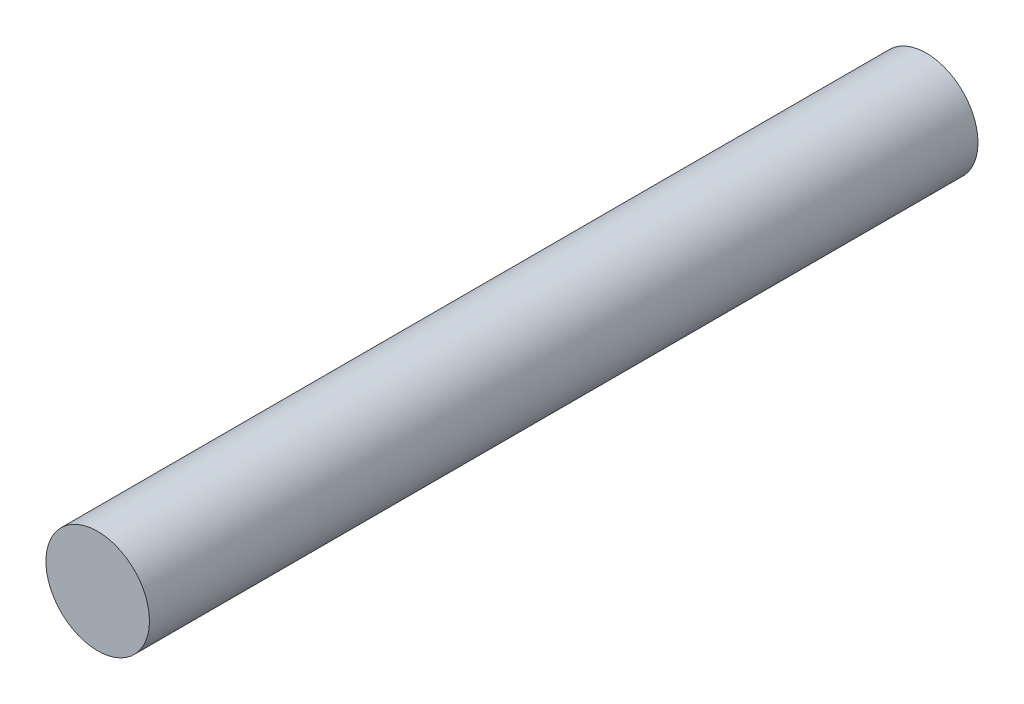
ISO-10303-21;
HEADER;
FILE_DESCRIPTION(('STEP AP214'),'2;1');
FILE_NAME('part.step','',(''),(''),'','','');
FILE_SCHEMA(('AUTOMOTIVE_DESIGN { 1 0 10303 214 1 1 1 1 }'));
ENDSEC;
DATA;
#1=APPLICATION_CONTEXT('core data for automotive mechanical design processes');
#2=APPLICATION_PROTOCOL_DEFINITION('international standard','automotive_design',2000,#1);
#3=PRODUCT_CONTEXT('',#1,'mechanical');
#4=PRODUCT('Part','Part','',(#3));
#5=PRODUCT_RELATED_PRODUCT_CATEGORY('part','',(#4));
#6=PRODUCT_DEFINITION_FORMATION('','',#4);
#7=PRODUCT_DEFINITION_CONTEXT('part definition',#1,'design');
#8=PRODUCT_DEFINITION('design','',#6,#7);
#9=PRODUCT_DEFINITION_SHAPE('','',#8);
#10=(LENGTH_UNIT() NAMED_UNIT(*) SI_UNIT(.MILLI.,.METRE.));
#11=(NAMED_UNIT(*) PLANE_ANGLE_UNIT() SI_UNIT($,.RADIAN.));
#12=(NAMED_UNIT(*) SI_UNIT($,.STERADIAN.) SOLID_ANGLE_UNIT());
#13=UNCERTAINTY_MEASURE_WITH_UNIT(LENGTH_MEASURE(1.E-05),#10,'distance_accuracy_value','');
#14=(GEOMETRIC_REPRESENTATION_CONTEXT(3) GLOBAL_UNCERTAINTY_ASSIGNED_CONTEXT((#13)) GLOBAL_UNIT_ASSIGNED_CONTEXT((#10,
#11,#12)) REPRESENTATION_CONTEXT('',''));
#15=CARTESIAN_POINT('',(0.,0.,0.));
#16=DIRECTION('',(0.,0.,1.));
#17=DIRECTION('',(1.,0.,0.));
#18=AXIS2_PLACEMENT_3D('',#15,#16,#17);
#19=CARTESIAN_POINT('',(0.,0.,4.));
#20=DIRECTION('',(0.,0.,-1.));
#21=DIRECTION('',(-1.,0.,0.));
#22=AXIS2_PLACEMENT_3D('',#19,#20,#21);
#23=CYLINDRICAL_SURFACE('',#22,0.25);
#24=CARTESIAN_POINT('',(0.,0.,4.));
#25=DIRECTION('',(0.,0.,1.));
#26=DIRECTION('',(1.,0.,0.));
#27=AXIS2_PLACEMENT_3D('',#24,#25,#26);
#28=CIRCLE('',#27,0.25);
#29=CARTESIAN_POINT('',(0.25,0.,4.));
#30=VERTEX_POINT('',#29);
#31=EDGE_CURVE('E10',#30,#30,#28,.T.);
#32=ORIENTED_EDGE('',*,*,#31,.F.);
#33=EDGE_LOOP('',(#32));
#34=FACE_BOUND('',#33,.T.);
#35=CARTESIAN_POINT('',(0.,0.,0.));
#36=DIRECTION('',(0.,0.,1.));
#37=DIRECTION('',(1.,0.,0.));
#38=AXIS2_PLACEMENT_3D('',#35,#36,#37);
#39=CIRCLE('',#38,0.25);
#40=CARTESIAN_POINT('',(0.25,0.,0.));
#41=VERTEX_POINT('',#40);
#42=EDGE_CURVE('E36',#41,#41,#39,.T.);
#43=ORIENTED_EDGE('',*,*,#42,.T.);
#44=EDGE_LOOP('',(#43));
#45=FACE_BOUND('',#44,.T.);
#46=ADVANCED_FACE('F33',(#34,#45),#23,.T.);
#47=CARTESIAN_POINT('',(0.,0.,4.));
#48=DIRECTION('',(0.,0.,1.));
#49=DIRECTION('',(1.,0.,0.));
#50=AXIS2_PLACEMENT_3D('',#47,#48,#49);
#51=PLANE('',#50);
#52=ORIENTED_EDGE('',*,*,#31,.T.);
#53=EDGE_LOOP('',(#52));
#54=FACE_BOUND('',#53,.T.);
#55=ADVANCED_FACE('F48',(#54),#51,.T.);
#56=CARTESIAN_POINT('',(0.,0.,0.));
#57=DIRECTION('',(0.,0.,1.));
#58=DIRECTION('',(1.,0.,0.));
#59=AXIS2_PLACEMENT_3D('',#56,#57,#58);
#60=PLANE('',#59);
#61=ORIENTED_EDGE('',*,*,#42,.F.);
#62=EDGE_LOOP('',(#61));
#63=FACE_BOUND('',#62,.T.);
#64=ADVANCED_FACE('F46',(#63),#60,.F.);
#65=CLOSED_SHELL('',(#46,#55,#64));
#66=MANIFOLD_SOLID_BREP('B2',#65);
#67=ADVANCED_BREP_SHAPE_REPRESENTATION('',(#18,#66),#14);
#68=SHAPE_DEFINITION_REPRESENTATION(#9,#67);
ENDSEC;
END-ISO-10303-21;
